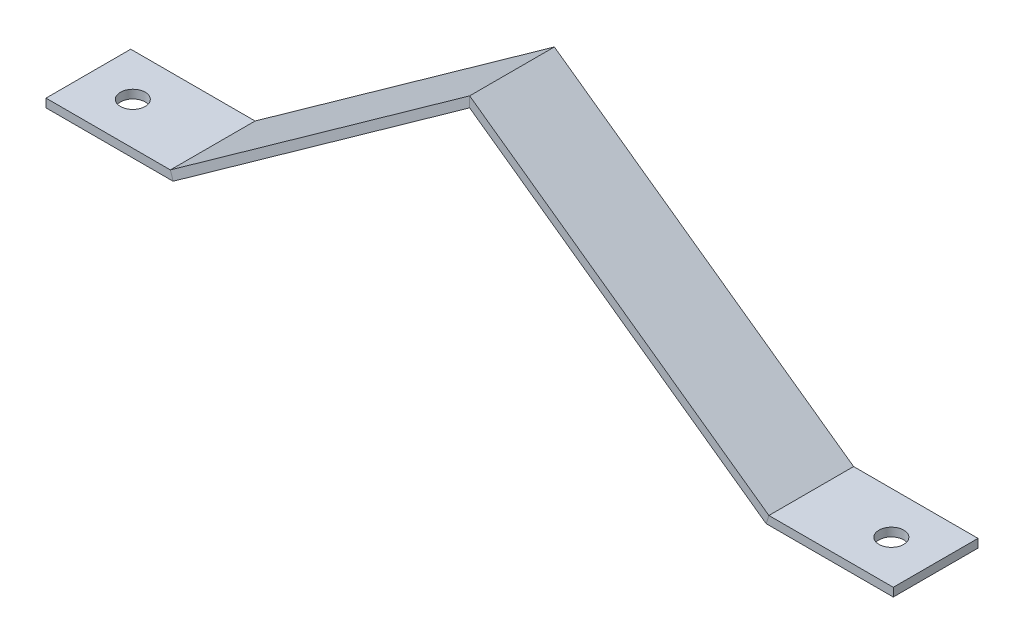
ISO-10303-21;
HEADER;
FILE_DESCRIPTION(('STEP AP214'),'2;1');
FILE_NAME('part.step','',(''),(''),'','','');
FILE_SCHEMA(('AUTOMOTIVE_DESIGN { 1 0 10303 214 1 1 1 1 }'));
ENDSEC;
DATA;
#1=APPLICATION_CONTEXT('core data for automotive mechanical design processes');
#2=APPLICATION_PROTOCOL_DEFINITION('international standard','automotive_design',2000,#1);
#3=PRODUCT_CONTEXT('',#1,'mechanical');
#4=PRODUCT('Part','Part','',(#3));
#5=PRODUCT_RELATED_PRODUCT_CATEGORY('part','',(#4));
#6=PRODUCT_DEFINITION_FORMATION('','',#4);
#7=PRODUCT_DEFINITION_CONTEXT('part definition',#1,'design');
#8=PRODUCT_DEFINITION('design','',#6,#7);
#9=PRODUCT_DEFINITION_SHAPE('','',#8);
#10=(LENGTH_UNIT() NAMED_UNIT(*) SI_UNIT(.MILLI.,.METRE.));
#11=(NAMED_UNIT(*) PLANE_ANGLE_UNIT() SI_UNIT($,.RADIAN.));
#12=(NAMED_UNIT(*) SI_UNIT($,.STERADIAN.) SOLID_ANGLE_UNIT());
#13=UNCERTAINTY_MEASURE_WITH_UNIT(LENGTH_MEASURE(1.E-05),#10,'distance_accuracy_value','');
#14=(GEOMETRIC_REPRESENTATION_CONTEXT(3) GLOBAL_UNCERTAINTY_ASSIGNED_CONTEXT((#13)) GLOBAL_UNIT_ASSIGNED_CONTEXT((#10,
#11,#12)) REPRESENTATION_CONTEXT('',''));
#15=CARTESIAN_POINT('',(0.,0.,0.));
#16=DIRECTION('',(0.,0.,1.));
#17=DIRECTION('',(1.,0.,0.));
#18=AXIS2_PLACEMENT_3D('',#15,#16,#17);
#19=CARTESIAN_POINT('',(-21.6713981235658,0.254000000000002,0.));
#20=DIRECTION('',(0.,-1.,0.));
#21=DIRECTION('',(1.,0.,0.));
#22=AXIS2_PLACEMENT_3D('',#19,#20,#21);
#23=PLANE('',#22);
#24=CARTESIAN_POINT('',(-24.0665,0.254000000000003,-1.27));
#25=DIRECTION('',(0.,1.,0.));
#26=DIRECTION('',(0.,0.,1.));
#27=AXIS2_PLACEMENT_3D('',#24,#25,#26);
#28=CIRCLE('',#27,0.370839999999987);
#29=CARTESIAN_POINT('',(-24.0665,0.254000000000003,-0.899160000000013));
#30=VERTEX_POINT('',#29);
#31=EDGE_CURVE('E319',#30,#30,#28,.T.);
#32=ORIENTED_EDGE('',*,*,#31,.F.);
#33=EDGE_LOOP('',(#32));
#34=FACE_BOUND('',#33,.T.);
#35=DIRECTION('',(0.,0.,-1.));
#36=VECTOR('',#35,1.);
#37=CARTESIAN_POINT('',(-25.4,0.254000000000002,0.));
#38=LINE('',#37,#36);
#39=CARTESIAN_POINT('',(-25.4,0.254000000000004,0.));
#40=VERTEX_POINT('',#39);
#41=CARTESIAN_POINT('',(-25.4,0.254000000000002,-2.54));
#42=VERTEX_POINT('',#41);
#43=EDGE_CURVE('E46',#40,#42,#38,.T.);
#44=ORIENTED_EDGE('',*,*,#43,.F.);
#45=DIRECTION('',(-1.,0.,0.));
#46=VECTOR('',#45,1.);
#47=CARTESIAN_POINT('',(-21.6713981235658,0.254000000000004,0.));
#48=LINE('',#47,#46);
#49=CARTESIAN_POINT('',(-21.6713981235658,0.254000000000004,0.));
#50=VERTEX_POINT('',#49);
#51=EDGE_CURVE('E185',#50,#40,#48,.T.);
#52=ORIENTED_EDGE('',*,*,#51,.F.);
#53=DIRECTION('',(0.,0.,1.));
#54=VECTOR('',#53,1.);
#55=CARTESIAN_POINT('',(-21.6713981235658,0.254000000000002,0.));
#56=LINE('',#55,#54);
#57=CARTESIAN_POINT('',(-21.6713981235658,0.254000000000002,-2.54));
#58=VERTEX_POINT('',#57);
#59=EDGE_CURVE('E181',#58,#50,#56,.T.);
#60=ORIENTED_EDGE('',*,*,#59,.F.);
#61=DIRECTION('',(-1.,0.,0.));
#62=VECTOR('',#61,1.);
#63=CARTESIAN_POINT('',(-21.6713981235658,0.254000000000002,-2.54));
#64=LINE('',#63,#62);
#65=EDGE_CURVE('E194',#58,#42,#64,.T.);
#66=ORIENTED_EDGE('',*,*,#65,.T.);
#67=EDGE_LOOP('',(#44,#52,#60,#66));
#68=FACE_BOUND('',#67,.T.);
#69=ADVANCED_FACE('F37',(#34,#68),#23,.F.);
#70=CARTESIAN_POINT('',(-20.5498857063736,-3.24564030481194,0.));
#71=DIRECTION('',(0.,0.,-1.));
#72=DIRECTION('',(-1.,0.,0.));
#73=AXIS2_PLACEMENT_3D('',#70,#71,#72);
#74=PLANE('',#73);
#75=DIRECTION('',(0.,1.,0.));
#76=VECTOR('',#75,1.);
#77=CARTESIAN_POINT('',(-25.4,-3.24564030481194,0.));
#78=LINE('',#77,#76);
#79=CARTESIAN_POINT('',(-25.4,0.,0.));
#80=VERTEX_POINT('',#79);
#81=EDGE_CURVE('E200',#80,#40,#78,.T.);
#82=ORIENTED_EDGE('',*,*,#81,.F.);
#83=DIRECTION('',(-1.,0.,0.));
#84=VECTOR('',#83,1.);
#85=CARTESIAN_POINT('',(-21.59,0.,0.));
#86=LINE('',#85,#84);
#87=CARTESIAN_POINT('',(-21.59,0.,0.));
#88=VERTEX_POINT('',#87);
#89=EDGE_CURVE('E188',#88,#80,#86,.T.);
#90=ORIENTED_EDGE('',*,*,#89,.F.);
#91=DIRECTION('',(0.305177431007984,-0.952295508549404,0.));
#92=VECTOR('',#91,1.);
#93=CARTESIAN_POINT('',(-20.5498857063736,-3.24564030481194,0.));
#94=LINE('',#93,#92);
#95=EDGE_CURVE('E184',#50,#88,#94,.T.);
#96=ORIENTED_EDGE('',*,*,#95,.F.);
#97=ORIENTED_EDGE('',*,*,#51,.T.);
#98=EDGE_LOOP('',(#82,#90,#96,#97));
#99=FACE_BOUND('',#98,.T.);
#100=ADVANCED_FACE('F256',(#99),#74,.F.);
#101=CARTESIAN_POINT('',(-21.59,0.,0.));
#102=DIRECTION('',(0.,1.,0.));
#103=DIRECTION('',(-1.,0.,0.));
#104=AXIS2_PLACEMENT_3D('',#101,#102,#103);
#105=PLANE('',#104);
#106=CARTESIAN_POINT('',(-24.0665,0.,-1.27));
#107=DIRECTION('',(0.,1.,0.));
#108=DIRECTION('',(0.,0.,1.));
#109=AXIS2_PLACEMENT_3D('',#106,#107,#108);
#110=CIRCLE('',#109,0.370840000000001);
#111=CARTESIAN_POINT('',(-24.0665,0.,-0.899159999999999));
#112=VERTEX_POINT('',#111);
#113=EDGE_CURVE('E317',#112,#112,#110,.T.);
#114=ORIENTED_EDGE('',*,*,#113,.T.);
#115=EDGE_LOOP('',(#114));
#116=FACE_BOUND('',#115,.T.);
#117=DIRECTION('',(0.,0.,1.));
#118=VECTOR('',#117,1.);
#119=CARTESIAN_POINT('',(-25.4,0.,0.));
#120=LINE('',#119,#118);
#121=CARTESIAN_POINT('',(-25.4,0.,-2.54));
#122=VERTEX_POINT('',#121);
#123=EDGE_CURVE('E196',#122,#80,#120,.T.);
#124=ORIENTED_EDGE('',*,*,#123,.F.);
#125=DIRECTION('',(-1.,0.,0.));
#126=VECTOR('',#125,1.);
#127=CARTESIAN_POINT('',(-21.59,0.,-2.54));
#128=LINE('',#127,#126);
#129=CARTESIAN_POINT('',(-21.59,0.,-2.54));
#130=VERTEX_POINT('',#129);
#131=EDGE_CURVE('E192',#130,#122,#128,.T.);
#132=ORIENTED_EDGE('',*,*,#131,.F.);
#133=DIRECTION('',(0.,0.,-1.));
#134=VECTOR('',#133,1.);
#135=CARTESIAN_POINT('',(-21.59,0.,0.));
#136=LINE('',#135,#134);
#137=EDGE_CURVE('E209',#88,#130,#136,.T.);
#138=ORIENTED_EDGE('',*,*,#137,.F.);
#139=ORIENTED_EDGE('',*,*,#89,.T.);
#140=EDGE_LOOP('',(#124,#132,#138,#139));
#141=FACE_BOUND('',#140,.T.);
#142=ADVANCED_FACE('F258',(#116,#141),#105,.F.);
#143=CARTESIAN_POINT('',(-20.5498857063736,-3.24564030481194,-2.54));
#144=DIRECTION('',(0.,0.,1.));
#145=DIRECTION('',(1.,0.,0.));
#146=AXIS2_PLACEMENT_3D('',#143,#144,#145);
#147=PLANE('',#146);
#148=DIRECTION('',(0.,-1.,0.));
#149=VECTOR('',#148,1.);
#150=CARTESIAN_POINT('',(-25.4,-3.24564030481194,-2.54));
#151=LINE('',#150,#149);
#152=EDGE_CURVE('E12',#42,#122,#151,.T.);
#153=ORIENTED_EDGE('',*,*,#152,.F.);
#154=ORIENTED_EDGE('',*,*,#65,.F.);
#155=DIRECTION('',(-0.305177431007984,0.952295508549404,0.));
#156=VECTOR('',#155,1.);
#157=CARTESIAN_POINT('',(-20.5498857063736,-3.24564030481194,-2.54));
#158=LINE('',#157,#156);
#159=EDGE_CURVE('E189',#130,#58,#158,.T.);
#160=ORIENTED_EDGE('',*,*,#159,.F.);
#161=ORIENTED_EDGE('',*,*,#131,.T.);
#162=EDGE_LOOP('',(#153,#154,#160,#161));
#163=FACE_BOUND('',#162,.T.);
#164=ADVANCED_FACE('F39',(#163),#147,.F.);
#165=CARTESIAN_POINT('',(-12.7,-0.730026262668107,0.));
#166=DIRECTION('',(0.,0.,1.));
#167=DIRECTION('',(1.,0.,0.));
#168=AXIS2_PLACEMENT_3D('',#165,#166,#167);
#169=PLANE('',#168);
#170=DIRECTION('',(-0.813733471206735,-0.581238193719096,0.));
#171=VECTOR('',#170,1.);
#172=CARTESIAN_POINT('',(-12.7,6.66214151683269,0.));
#173=LINE('',#172,#171);
#174=CARTESIAN_POINT('',(-12.7,6.66214151683269,0.));
#175=VERTEX_POINT('',#174);
#176=EDGE_CURVE('E178',#175,#50,#173,.T.);
#177=ORIENTED_EDGE('',*,*,#176,.T.);
#178=ORIENTED_EDGE('',*,*,#95,.T.);
#179=DIRECTION('',(-0.813733471206735,-0.581238193719096,0.));
#180=VECTOR('',#179,1.);
#181=CARTESIAN_POINT('',(-12.7,6.35,0.));
#182=LINE('',#181,#180);
#183=CARTESIAN_POINT('',(-12.7,6.35,0.));
#184=VERTEX_POINT('',#183);
#185=EDGE_CURVE('E168',#184,#88,#182,.T.);
#186=ORIENTED_EDGE('',*,*,#185,.F.);
#187=DIRECTION('',(0.,1.,0.));
#188=VECTOR('',#187,1.);
#189=CARTESIAN_POINT('',(-12.7,-0.730026262668107,0.));
#190=LINE('',#189,#188);
#191=EDGE_CURVE('E169',#184,#175,#190,.T.);
#192=ORIENTED_EDGE('',*,*,#191,.T.);
#193=EDGE_LOOP('',(#177,#178,#186,#192));
#194=FACE_BOUND('',#193,.T.);
#195=ADVANCED_FACE('F245',(#194),#169,.T.);
#196=CARTESIAN_POINT('',(-12.7,6.35,0.));
#197=DIRECTION('',(0.581238193719096,-0.813733471206735,0.));
#198=DIRECTION('',(0.813733471206735,0.581238193719096,0.));
#199=AXIS2_PLACEMENT_3D('',#196,#197,#198);
#200=PLANE('',#199);
#201=ORIENTED_EDGE('',*,*,#185,.T.);
#202=ORIENTED_EDGE('',*,*,#137,.T.);
#203=DIRECTION('',(-0.813733471206735,-0.581238193719096,0.));
#204=VECTOR('',#203,1.);
#205=CARTESIAN_POINT('',(-12.7,6.35,-2.54));
#206=LINE('',#205,#204);
#207=CARTESIAN_POINT('',(-12.7,6.35,-2.54));
#208=VERTEX_POINT('',#207);
#209=EDGE_CURVE('E172',#208,#130,#206,.T.);
#210=ORIENTED_EDGE('',*,*,#209,.F.);
#211=DIRECTION('',(0.,0.,1.));
#212=VECTOR('',#211,1.);
#213=CARTESIAN_POINT('',(-12.7,6.35,0.));
#214=LINE('',#213,#212);
#215=EDGE_CURVE('E216',#208,#184,#214,.T.);
#216=ORIENTED_EDGE('',*,*,#215,.T.);
#217=EDGE_LOOP('',(#201,#202,#210,#216));
#218=FACE_BOUND('',#217,.T.);
#219=ADVANCED_FACE('F248',(#218),#200,.T.);
#220=CARTESIAN_POINT('',(-12.7,-0.730026262668107,-2.54));
#221=DIRECTION('',(0.,0.,-1.));
#222=DIRECTION('',(-1.,0.,0.));
#223=AXIS2_PLACEMENT_3D('',#220,#221,#222);
#224=PLANE('',#223);
#225=ORIENTED_EDGE('',*,*,#209,.T.);
#226=ORIENTED_EDGE('',*,*,#159,.T.);
#227=DIRECTION('',(-0.813733471206735,-0.581238193719096,0.));
#228=VECTOR('',#227,1.);
#229=CARTESIAN_POINT('',(-12.7,6.66214151683269,-2.54));
#230=LINE('',#229,#228);
#231=CARTESIAN_POINT('',(-12.7,6.66214151683269,-2.54));
#232=VERTEX_POINT('',#231);
#233=EDGE_CURVE('E175',#232,#58,#230,.T.);
#234=ORIENTED_EDGE('',*,*,#233,.F.);
#235=DIRECTION('',(0.,-1.,0.));
#236=VECTOR('',#235,1.);
#237=CARTESIAN_POINT('',(-12.7,-0.730026262668107,-2.54));
#238=LINE('',#237,#236);
#239=EDGE_CURVE('E164',#232,#208,#238,.T.);
#240=ORIENTED_EDGE('',*,*,#239,.T.);
#241=EDGE_LOOP('',(#225,#226,#234,#240));
#242=FACE_BOUND('',#241,.T.);
#243=ADVANCED_FACE('F251',(#242),#224,.T.);
#244=CARTESIAN_POINT('',(-12.7,6.66214151683269,0.));
#245=DIRECTION('',(-0.581238193719096,0.813733471206735,0.));
#246=DIRECTION('',(-0.813733471206735,-0.581238193719096,0.));
#247=AXIS2_PLACEMENT_3D('',#244,#245,#246);
#248=PLANE('',#247);
#249=ORIENTED_EDGE('',*,*,#233,.T.);
#250=ORIENTED_EDGE('',*,*,#59,.T.);
#251=ORIENTED_EDGE('',*,*,#176,.F.);
#252=DIRECTION('',(0.,0.,-1.));
#253=VECTOR('',#252,1.);
#254=CARTESIAN_POINT('',(-12.7,6.66214151683269,0.));
#255=LINE('',#254,#253);
#256=EDGE_CURVE('E165',#175,#232,#255,.T.);
#257=ORIENTED_EDGE('',*,*,#256,.T.);
#258=EDGE_LOOP('',(#249,#250,#251,#257));
#259=FACE_BOUND('',#258,.T.);
#260=ADVANCED_FACE('F254',(#259),#248,.T.);
#261=CARTESIAN_POINT('',(-4.04394790525557,-0.730026262668108,0.));
#262=DIRECTION('',(0.,0.,-1.));
#263=DIRECTION('',(-1.,0.,0.));
#264=AXIS2_PLACEMENT_3D('',#261,#262,#263);
#265=PLANE('',#264);
#266=ORIENTED_EDGE('',*,*,#191,.F.);
#267=DIRECTION('',(-0.813733471206735,0.581238193719096,0.));
#268=VECTOR('',#267,1.);
#269=CARTESIAN_POINT('',(-3.81000000000001,0.,0.));
#270=LINE('',#269,#268);
#271=CARTESIAN_POINT('',(-3.81000000000001,0.,0.));
#272=VERTEX_POINT('',#271);
#273=EDGE_CURVE('E151',#272,#184,#270,.T.);
#274=ORIENTED_EDGE('',*,*,#273,.F.);
#275=DIRECTION('',(-0.305177431007984,-0.952295508549404,0.));
#276=VECTOR('',#275,1.);
#277=CARTESIAN_POINT('',(-4.04394790525557,-0.730026262668108,0.));
#278=LINE('',#277,#276);
#279=CARTESIAN_POINT('',(-3.72860187643424,0.254,0.));
#280=VERTEX_POINT('',#279);
#281=EDGE_CURVE('E117',#280,#272,#278,.T.);
#282=ORIENTED_EDGE('',*,*,#281,.F.);
#283=DIRECTION('',(-0.813733471206735,0.581238193719096,0.));
#284=VECTOR('',#283,1.);
#285=CARTESIAN_POINT('',(-3.72860187643424,0.254,0.));
#286=LINE('',#285,#284);
#287=EDGE_CURVE('E161',#280,#175,#286,.T.);
#288=ORIENTED_EDGE('',*,*,#287,.T.);
#289=EDGE_LOOP('',(#266,#274,#282,#288));
#290=FACE_BOUND('',#289,.T.);
#291=ADVANCED_FACE('F243',(#290),#265,.F.);
#292=CARTESIAN_POINT('',(-3.81,0.,0.));
#293=DIRECTION('',(0.581238193719096,0.813733471206735,0.));
#294=DIRECTION('',(-0.813733471206735,0.581238193719096,0.));
#295=AXIS2_PLACEMENT_3D('',#292,#293,#294);
#296=PLANE('',#295);
#297=ORIENTED_EDGE('',*,*,#215,.F.);
#298=DIRECTION('',(-0.813733471206735,0.581238193719096,0.));
#299=VECTOR('',#298,1.);
#300=CARTESIAN_POINT('',(-3.81,0.,-2.54));
#301=LINE('',#300,#299);
#302=CARTESIAN_POINT('',(-3.81,0.,-2.54));
#303=VERTEX_POINT('',#302);
#304=EDGE_CURVE('E154',#303,#208,#301,.T.);
#305=ORIENTED_EDGE('',*,*,#304,.F.);
#306=DIRECTION('',(0.,0.,-1.));
#307=VECTOR('',#306,1.);
#308=CARTESIAN_POINT('',(-3.81,0.,0.));
#309=LINE('',#308,#307);
#310=EDGE_CURVE('E140',#272,#303,#309,.T.);
#311=ORIENTED_EDGE('',*,*,#310,.F.);
#312=ORIENTED_EDGE('',*,*,#273,.T.);
#313=EDGE_LOOP('',(#297,#305,#311,#312));
#314=FACE_BOUND('',#313,.T.);
#315=ADVANCED_FACE('F229',(#314),#296,.F.);
#316=CARTESIAN_POINT('',(-4.04394790525557,-0.730026262668108,-2.54));
#317=DIRECTION('',(0.,0.,1.));
#318=DIRECTION('',(1.,0.,0.));
#319=AXIS2_PLACEMENT_3D('',#316,#317,#318);
#320=PLANE('',#319);
#321=ORIENTED_EDGE('',*,*,#239,.F.);
#322=DIRECTION('',(-0.813733471206735,0.581238193719096,0.));
#323=VECTOR('',#322,1.);
#324=CARTESIAN_POINT('',(-3.72860187643424,0.254,-2.54));
#325=LINE('',#324,#323);
#326=CARTESIAN_POINT('',(-3.72860187643424,0.254,-2.54));
#327=VERTEX_POINT('',#326);
#328=EDGE_CURVE('E158',#327,#232,#325,.T.);
#329=ORIENTED_EDGE('',*,*,#328,.F.);
#330=DIRECTION('',(0.305177431007984,0.952295508549404,0.));
#331=VECTOR('',#330,1.);
#332=CARTESIAN_POINT('',(-4.04394790525557,-0.730026262668108,-2.54));
#333=LINE('',#332,#331);
#334=EDGE_CURVE('E222',#303,#327,#333,.T.);
#335=ORIENTED_EDGE('',*,*,#334,.F.);
#336=ORIENTED_EDGE('',*,*,#304,.T.);
#337=EDGE_LOOP('',(#321,#329,#335,#336));
#338=FACE_BOUND('',#337,.T.);
#339=ADVANCED_FACE('F232',(#338),#320,.F.);
#340=CARTESIAN_POINT('',(-3.72860187643424,0.254,0.));
#341=DIRECTION('',(-0.581238193719096,-0.813733471206735,0.));
#342=DIRECTION('',(0.813733471206735,-0.581238193719096,0.));
#343=AXIS2_PLACEMENT_3D('',#340,#341,#342);
#344=PLANE('',#343);
#345=ORIENTED_EDGE('',*,*,#256,.F.);
#346=ORIENTED_EDGE('',*,*,#287,.F.);
#347=DIRECTION('',(0.,0.,1.));
#348=VECTOR('',#347,1.);
#349=CARTESIAN_POINT('',(-3.72860187643424,0.254,0.));
#350=LINE('',#349,#348);
#351=EDGE_CURVE('E155',#327,#280,#350,.T.);
#352=ORIENTED_EDGE('',*,*,#351,.F.);
#353=ORIENTED_EDGE('',*,*,#328,.T.);
#354=EDGE_LOOP('',(#345,#346,#352,#353));
#355=FACE_BOUND('',#354,.T.);
#356=ADVANCED_FACE('F240',(#355),#344,.F.);
#357=CARTESIAN_POINT('',(0.,0.,0.));
#358=DIRECTION('',(-1.,0.,0.));
#359=DIRECTION('',(0.,0.,1.));
#360=AXIS2_PLACEMENT_3D('',#357,#358,#359);
#361=PLANE('',#360);
#362=DIRECTION('',(0.,-1.,0.));
#363=VECTOR('',#362,1.);
#364=CARTESIAN_POINT('',(0.,0.,0.));
#365=LINE('',#364,#363);
#366=CARTESIAN_POINT('',(0.,0.254,0.));
#367=VERTEX_POINT('',#366);
#368=CARTESIAN_POINT('',(0.,0.,0.));
#369=VERTEX_POINT('',#368);
#370=EDGE_CURVE('E114',#367,#369,#365,.T.);
#371=ORIENTED_EDGE('',*,*,#370,.T.);
#372=DIRECTION('',(0.,0.,-1.));
#373=VECTOR('',#372,1.);
#374=CARTESIAN_POINT('',(0.,0.,0.));
#375=LINE('',#374,#373);
#376=CARTESIAN_POINT('',(0.,0.,-2.54));
#377=VERTEX_POINT('',#376);
#378=EDGE_CURVE('E124',#369,#377,#375,.T.);
#379=ORIENTED_EDGE('',*,*,#378,.T.);
#380=DIRECTION('',(0.,1.,0.));
#381=VECTOR('',#380,1.);
#382=CARTESIAN_POINT('',(0.,0.,-2.54));
#383=LINE('',#382,#381);
#384=CARTESIAN_POINT('',(0.,0.254,-2.54));
#385=VERTEX_POINT('',#384);
#386=EDGE_CURVE('E130',#377,#385,#383,.T.);
#387=ORIENTED_EDGE('',*,*,#386,.T.);
#388=DIRECTION('',(0.,0.,1.));
#389=VECTOR('',#388,1.);
#390=CARTESIAN_POINT('',(0.,0.254,0.));
#391=LINE('',#390,#389);
#392=EDGE_CURVE('E121',#385,#367,#391,.T.);
#393=ORIENTED_EDGE('',*,*,#392,.T.);
#394=EDGE_LOOP('',(#371,#379,#387,#393));
#395=FACE_BOUND('',#394,.T.);
#396=ADVANCED_FACE('F132',(#395),#361,.F.);
#397=CARTESIAN_POINT('',(-6.32196934598183,0.,0.));
#398=DIRECTION('',(0.,0.,1.));
#399=DIRECTION('',(1.,0.,0.));
#400=AXIS2_PLACEMENT_3D('',#397,#398,#399);
#401=PLANE('',#400);
#402=DIRECTION('',(1.,0.,0.));
#403=VECTOR('',#402,1.);
#404=CARTESIAN_POINT('',(-6.32196934598183,0.253999999999999,0.));
#405=LINE('',#404,#403);
#406=EDGE_CURVE('E145',#280,#367,#405,.T.);
#407=ORIENTED_EDGE('',*,*,#406,.F.);
#408=ORIENTED_EDGE('',*,*,#281,.T.);
#409=DIRECTION('',(1.,0.,0.));
#410=VECTOR('',#409,1.);
#411=CARTESIAN_POINT('',(-6.32196934598183,0.,0.));
#412=LINE('',#411,#410);
#413=EDGE_CURVE('E109',#272,#369,#412,.T.);
#414=ORIENTED_EDGE('',*,*,#413,.T.);
#415=ORIENTED_EDGE('',*,*,#370,.F.);
#416=EDGE_LOOP('',(#407,#408,#414,#415));
#417=FACE_BOUND('',#416,.T.);
#418=ADVANCED_FACE('F112',(#417),#401,.T.);
#419=CARTESIAN_POINT('',(-6.32196934598183,0.253999999999999,0.));
#420=DIRECTION('',(0.,1.,0.));
#421=DIRECTION('',(-1.,0.,0.));
#422=AXIS2_PLACEMENT_3D('',#419,#420,#421);
#423=PLANE('',#422);
#424=CARTESIAN_POINT('',(-1.3271754,0.254000000000004,-1.27));
#425=DIRECTION('',(0.,1.,0.));
#426=DIRECTION('',(0.,0.,1.));
#427=AXIS2_PLACEMENT_3D('',#424,#425,#426);
#428=CIRCLE('',#427,0.370839999999987);
#429=CARTESIAN_POINT('',(-1.3271754,0.254000000000004,-0.899160000000013));
#430=VERTEX_POINT('',#429);
#431=EDGE_CURVE('E137',#430,#430,#428,.T.);
#432=ORIENTED_EDGE('',*,*,#431,.F.);
#433=EDGE_LOOP('',(#432));
#434=FACE_BOUND('',#433,.T.);
#435=DIRECTION('',(1.,0.,0.));
#436=VECTOR('',#435,1.);
#437=CARTESIAN_POINT('',(-6.32196934598183,0.253999999999999,-2.54));
#438=LINE('',#437,#436);
#439=EDGE_CURVE('E147',#327,#385,#438,.T.);
#440=ORIENTED_EDGE('',*,*,#439,.F.);
#441=ORIENTED_EDGE('',*,*,#351,.T.);
#442=ORIENTED_EDGE('',*,*,#406,.T.);
#443=ORIENTED_EDGE('',*,*,#392,.F.);
#444=EDGE_LOOP('',(#440,#441,#442,#443));
#445=FACE_BOUND('',#444,.T.);
#446=ADVANCED_FACE('F237',(#434,#445),#423,.T.);
#447=CARTESIAN_POINT('',(-6.32196934598183,0.,-2.54));
#448=DIRECTION('',(0.,0.,-1.));
#449=DIRECTION('',(-1.,0.,0.));
#450=AXIS2_PLACEMENT_3D('',#447,#448,#449);
#451=PLANE('',#450);
#452=DIRECTION('',(1.,0.,0.));
#453=VECTOR('',#452,1.);
#454=CARTESIAN_POINT('',(-6.32196934598183,0.,-2.54));
#455=LINE('',#454,#453);
#456=EDGE_CURVE('E120',#303,#377,#455,.T.);
#457=ORIENTED_EDGE('',*,*,#456,.F.);
#458=ORIENTED_EDGE('',*,*,#334,.T.);
#459=ORIENTED_EDGE('',*,*,#439,.T.);
#460=ORIENTED_EDGE('',*,*,#386,.F.);
#461=EDGE_LOOP('',(#457,#458,#459,#460));
#462=FACE_BOUND('',#461,.T.);
#463=ADVANCED_FACE('F234',(#462),#451,.T.);
#464=CARTESIAN_POINT('',(-6.32196934598183,0.,0.));
#465=DIRECTION('',(0.,-1.,0.));
#466=DIRECTION('',(1.,0.,0.));
#467=AXIS2_PLACEMENT_3D('',#464,#465,#466);
#468=PLANE('',#467);
#469=CARTESIAN_POINT('',(-1.3271754,0.,-1.27));
#470=DIRECTION('',(0.,1.,0.));
#471=DIRECTION('',(0.,0.,1.));
#472=AXIS2_PLACEMENT_3D('',#469,#470,#471);
#473=CIRCLE('',#472,0.370839999999999);
#474=CARTESIAN_POINT('',(-1.3271754,0.,-0.899160000000001));
#475=VERTEX_POINT('',#474);
#476=EDGE_CURVE('E134',#475,#475,#473,.T.);
#477=ORIENTED_EDGE('',*,*,#476,.T.);
#478=EDGE_LOOP('',(#477));
#479=FACE_BOUND('',#478,.T.);
#480=ORIENTED_EDGE('',*,*,#413,.F.);
#481=ORIENTED_EDGE('',*,*,#310,.T.);
#482=ORIENTED_EDGE('',*,*,#456,.T.);
#483=ORIENTED_EDGE('',*,*,#378,.F.);
#484=EDGE_LOOP('',(#480,#481,#482,#483));
#485=FACE_BOUND('',#484,.T.);
#486=ADVANCED_FACE('F125',(#479,#485),#468,.T.);
#487=CARTESIAN_POINT('',(-25.4,0.127000000000003,-1.27));
#488=DIRECTION('',(-1.,0.,0.));
#489=DIRECTION('',(0.,-1.,0.));
#490=AXIS2_PLACEMENT_3D('',#487,#488,#489);
#491=PLANE('',#490);
#492=ORIENTED_EDGE('',*,*,#43,.T.);
#493=ORIENTED_EDGE('',*,*,#152,.T.);
#494=ORIENTED_EDGE('',*,*,#123,.T.);
#495=ORIENTED_EDGE('',*,*,#81,.T.);
#496=EDGE_LOOP('',(#492,#493,#494,#495));
#497=FACE_BOUND('',#496,.T.);
#498=ADVANCED_FACE('F294',(#497),#491,.T.);
#499=CARTESIAN_POINT('',(-1.3271754,0.254000000000002,-1.27));
#500=DIRECTION('',(0.,1.,0.));
#501=DIRECTION('',(0.,0.,1.));
#502=AXIS2_PLACEMENT_3D('',#499,#500,#501);
#503=CYLINDRICAL_SURFACE('',#502,0.370839999999993);
#504=ORIENTED_EDGE('',*,*,#476,.F.);
#505=EDGE_LOOP('',(#504));
#506=FACE_BOUND('',#505,.T.);
#507=ORIENTED_EDGE('',*,*,#431,.T.);
#508=EDGE_LOOP('',(#507));
#509=FACE_BOUND('',#508,.T.);
#510=ADVANCED_FACE('F305',(#506,#509),#503,.F.);
#511=CARTESIAN_POINT('',(-24.0665,0.254000000000002,-1.27));
#512=DIRECTION('',(0.,1.,0.));
#513=DIRECTION('',(0.,0.,1.));
#514=AXIS2_PLACEMENT_3D('',#511,#512,#513);
#515=CYLINDRICAL_SURFACE('',#514,0.370839999999994);
#516=ORIENTED_EDGE('',*,*,#113,.F.);
#517=EDGE_LOOP('',(#516));
#518=FACE_BOUND('',#517,.T.);
#519=ORIENTED_EDGE('',*,*,#31,.T.);
#520=EDGE_LOOP('',(#519));
#521=FACE_BOUND('',#520,.T.);
#522=ADVANCED_FACE('F308',(#518,#521),#515,.F.);
#523=CLOSED_SHELL('',(#69,#100,#142,#164,#195,#219,#243,#260,#291,#315,#339,#356,#396,#418,#446,
#463,#486,#498,#510,#522));
#524=MANIFOLD_SOLID_BREP('B2',#523);
#525=ADVANCED_BREP_SHAPE_REPRESENTATION('',(#18,#524),#14);
#526=SHAPE_DEFINITION_REPRESENTATION(#9,#525);
ENDSEC;
END-ISO-10303-21;
